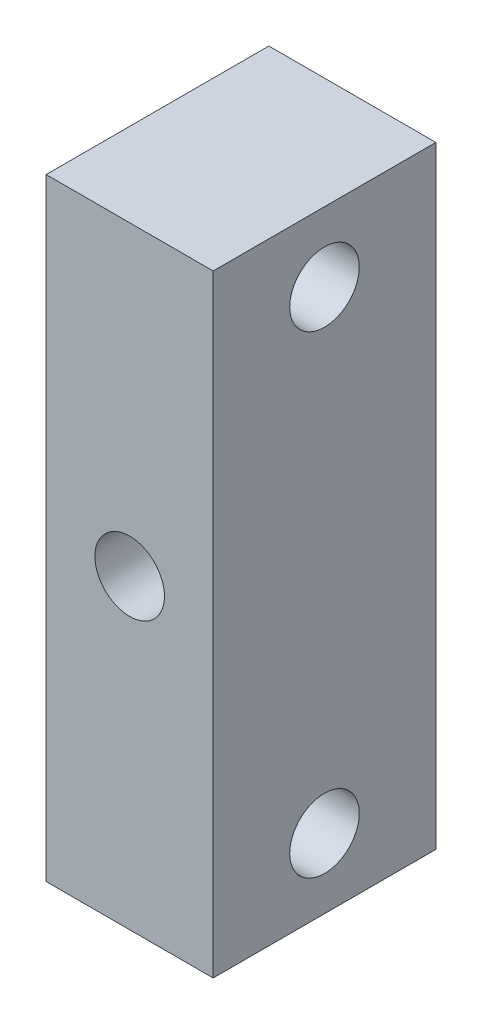
ISO-10303-21;
HEADER;
FILE_DESCRIPTION(('STEP AP214'),'2;1');
FILE_NAME('part.step','',(''),(''),'','','');
FILE_SCHEMA(('AUTOMOTIVE_DESIGN { 1 0 10303 214 1 1 1 1 }'));
ENDSEC;
DATA;
#1=APPLICATION_CONTEXT('core data for automotive mechanical design processes');
#2=APPLICATION_PROTOCOL_DEFINITION('international standard','automotive_design',2000,#1);
#3=PRODUCT_CONTEXT('',#1,'mechanical');
#4=PRODUCT('Part','Part','',(#3));
#5=PRODUCT_RELATED_PRODUCT_CATEGORY('part','',(#4));
#6=PRODUCT_DEFINITION_FORMATION('','',#4);
#7=PRODUCT_DEFINITION_CONTEXT('part definition',#1,'design');
#8=PRODUCT_DEFINITION('design','',#6,#7);
#9=PRODUCT_DEFINITION_SHAPE('','',#8);
#10=(LENGTH_UNIT() NAMED_UNIT(*) SI_UNIT(.MILLI.,.METRE.));
#11=(NAMED_UNIT(*) PLANE_ANGLE_UNIT() SI_UNIT($,.RADIAN.));
#12=(NAMED_UNIT(*) SI_UNIT($,.STERADIAN.) SOLID_ANGLE_UNIT());
#13=UNCERTAINTY_MEASURE_WITH_UNIT(LENGTH_MEASURE(1.E-05),#10,'distance_accuracy_value','');
#14=(GEOMETRIC_REPRESENTATION_CONTEXT(3) GLOBAL_UNCERTAINTY_ASSIGNED_CONTEXT((#13)) GLOBAL_UNIT_ASSIGNED_CONTEXT((#10,
#11,#12)) REPRESENTATION_CONTEXT('',''));
#15=CARTESIAN_POINT('',(0.,0.,0.));
#16=DIRECTION('',(0.,0.,1.));
#17=DIRECTION('',(1.,0.,0.));
#18=AXIS2_PLACEMENT_3D('',#15,#16,#17);
#19=CARTESIAN_POINT('',(3.,11.,-4.));
#20=DIRECTION('',(-1.,0.,0.));
#21=DIRECTION('',(0.,0.,1.));
#22=AXIS2_PLACEMENT_3D('',#19,#20,#21);
#23=PLANE('',#22);
#24=CARTESIAN_POINT('',(3.,8.5,0.));
#25=DIRECTION('',(-1.,0.,0.));
#26=DIRECTION('',(0.,0.,1.));
#27=AXIS2_PLACEMENT_3D('',#24,#25,#26);
#28=CIRCLE('',#27,1.25);
#29=CARTESIAN_POINT('',(3.,8.5,1.25));
#30=VERTEX_POINT('',#29);
#31=EDGE_CURVE('E115',#30,#30,#28,.T.);
#32=ORIENTED_EDGE('',*,*,#31,.T.);
#33=EDGE_LOOP('',(#32));
#34=FACE_BOUND('',#33,.T.);
#35=CARTESIAN_POINT('',(3.,-8.5,0.));
#36=DIRECTION('',(-1.,0.,0.));
#37=DIRECTION('',(0.,0.,1.));
#38=AXIS2_PLACEMENT_3D('',#35,#36,#37);
#39=CIRCLE('',#38,1.25);
#40=CARTESIAN_POINT('',(3.,-8.5,1.25));
#41=VERTEX_POINT('',#40);
#42=EDGE_CURVE('E121',#41,#41,#39,.T.);
#43=ORIENTED_EDGE('',*,*,#42,.T.);
#44=EDGE_LOOP('',(#43));
#45=FACE_BOUND('',#44,.T.);
#46=DIRECTION('',(0.,0.,-1.));
#47=VECTOR('',#46,1.);
#48=CARTESIAN_POINT('',(3.,-11.,-4.));
#49=LINE('',#48,#47);
#50=CARTESIAN_POINT('',(3.,-11.,4.));
#51=VERTEX_POINT('',#50);
#52=CARTESIAN_POINT('',(3.,-11.,-4.));
#53=VERTEX_POINT('',#52);
#54=EDGE_CURVE('E98',#51,#53,#49,.T.);
#55=ORIENTED_EDGE('',*,*,#54,.T.);
#56=DIRECTION('',(0.,-1.,0.));
#57=VECTOR('',#56,1.);
#58=CARTESIAN_POINT('',(3.,11.,-4.));
#59=LINE('',#58,#57);
#60=CARTESIAN_POINT('',(3.,11.,-4.));
#61=VERTEX_POINT('',#60);
#62=EDGE_CURVE('E11',#61,#53,#59,.T.);
#63=ORIENTED_EDGE('',*,*,#62,.F.);
#64=DIRECTION('',(0.,0.,-1.));
#65=VECTOR('',#64,1.);
#66=CARTESIAN_POINT('',(3.,11.,-4.));
#67=LINE('',#66,#65);
#68=CARTESIAN_POINT('',(3.,11.,4.));
#69=VERTEX_POINT('',#68);
#70=EDGE_CURVE('E86',#69,#61,#67,.T.);
#71=ORIENTED_EDGE('',*,*,#70,.F.);
#72=DIRECTION('',(0.,-1.,0.));
#73=VECTOR('',#72,1.);
#74=CARTESIAN_POINT('',(3.,11.,4.));
#75=LINE('',#74,#73);
#76=EDGE_CURVE('E94',#69,#51,#75,.T.);
#77=ORIENTED_EDGE('',*,*,#76,.T.);
#78=EDGE_LOOP('',(#55,#63,#71,#77));
#79=FACE_BOUND('',#78,.T.);
#80=ADVANCED_FACE('F35',(#34,#45,#79),#23,.F.);
#81=CARTESIAN_POINT('',(-3.,11.,-4.));
#82=DIRECTION('',(0.,0.,1.));
#83=DIRECTION('',(1.,0.,0.));
#84=AXIS2_PLACEMENT_3D('',#81,#82,#83);
#85=PLANE('',#84);
#86=CARTESIAN_POINT('',(0.,0.,-4.));
#87=DIRECTION('',(0.,0.,1.));
#88=DIRECTION('',(1.,0.,0.));
#89=AXIS2_PLACEMENT_3D('',#86,#87,#88);
#90=CIRCLE('',#89,1.25);
#91=CARTESIAN_POINT('',(1.25,0.,-4.));
#92=VERTEX_POINT('',#91);
#93=EDGE_CURVE('E101',#92,#92,#90,.T.);
#94=ORIENTED_EDGE('',*,*,#93,.T.);
#95=EDGE_LOOP('',(#94));
#96=FACE_BOUND('',#95,.T.);
#97=DIRECTION('',(-1.,0.,0.));
#98=VECTOR('',#97,1.);
#99=CARTESIAN_POINT('',(-3.,-11.,-4.));
#100=LINE('',#99,#98);
#101=CARTESIAN_POINT('',(-3.,-11.,-4.));
#102=VERTEX_POINT('',#101);
#103=EDGE_CURVE('E90',#53,#102,#100,.T.);
#104=ORIENTED_EDGE('',*,*,#103,.T.);
#105=DIRECTION('',(0.,-1.,0.));
#106=VECTOR('',#105,1.);
#107=CARTESIAN_POINT('',(-3.,11.,-4.));
#108=LINE('',#107,#106);
#109=CARTESIAN_POINT('',(-3.,11.,-4.));
#110=VERTEX_POINT('',#109);
#111=EDGE_CURVE('E43',#110,#102,#108,.T.);
#112=ORIENTED_EDGE('',*,*,#111,.F.);
#113=DIRECTION('',(-1.,0.,0.));
#114=VECTOR('',#113,1.);
#115=CARTESIAN_POINT('',(-3.,11.,-4.));
#116=LINE('',#115,#114);
#117=EDGE_CURVE('E81',#61,#110,#116,.T.);
#118=ORIENTED_EDGE('',*,*,#117,.F.);
#119=ORIENTED_EDGE('',*,*,#62,.T.);
#120=EDGE_LOOP('',(#104,#112,#118,#119));
#121=FACE_BOUND('',#120,.T.);
#122=ADVANCED_FACE('F89',(#96,#121),#85,.F.);
#123=CARTESIAN_POINT('',(-3.,11.,-4.));
#124=DIRECTION('',(1.,0.,0.));
#125=DIRECTION('',(0.,0.,-1.));
#126=AXIS2_PLACEMENT_3D('',#123,#124,#125);
#127=PLANE('',#126);
#128=CARTESIAN_POINT('',(-3.,8.5,0.));
#129=DIRECTION('',(-1.,0.,0.));
#130=DIRECTION('',(0.,0.,1.));
#131=AXIS2_PLACEMENT_3D('',#128,#129,#130);
#132=CIRCLE('',#131,1.25);
#133=CARTESIAN_POINT('',(-3.,8.5,1.25));
#134=VERTEX_POINT('',#133);
#135=EDGE_CURVE('E124',#134,#134,#132,.T.);
#136=ORIENTED_EDGE('',*,*,#135,.F.);
#137=EDGE_LOOP('',(#136));
#138=FACE_BOUND('',#137,.T.);
#139=CARTESIAN_POINT('',(-3.,-8.5,0.));
#140=DIRECTION('',(-1.,0.,0.));
#141=DIRECTION('',(0.,0.,1.));
#142=AXIS2_PLACEMENT_3D('',#139,#140,#141);
#143=CIRCLE('',#142,1.25);
#144=CARTESIAN_POINT('',(-3.,-8.5,1.25));
#145=VERTEX_POINT('',#144);
#146=EDGE_CURVE('E118',#145,#145,#143,.T.);
#147=ORIENTED_EDGE('',*,*,#146,.F.);
#148=EDGE_LOOP('',(#147));
#149=FACE_BOUND('',#148,.T.);
#150=DIRECTION('',(0.,0.,1.));
#151=VECTOR('',#150,1.);
#152=CARTESIAN_POINT('',(-3.,-11.,-4.));
#153=LINE('',#152,#151);
#154=CARTESIAN_POINT('',(-3.,-11.,4.));
#155=VERTEX_POINT('',#154);
#156=EDGE_CURVE('E68',#102,#155,#153,.T.);
#157=ORIENTED_EDGE('',*,*,#156,.T.);
#158=DIRECTION('',(0.,-1.,0.));
#159=VECTOR('',#158,1.);
#160=CARTESIAN_POINT('',(-3.,11.,4.));
#161=LINE('',#160,#159);
#162=CARTESIAN_POINT('',(-3.,11.,4.));
#163=VERTEX_POINT('',#162);
#164=EDGE_CURVE('E91',#163,#155,#161,.T.);
#165=ORIENTED_EDGE('',*,*,#164,.F.);
#166=DIRECTION('',(0.,0.,1.));
#167=VECTOR('',#166,1.);
#168=CARTESIAN_POINT('',(-3.,11.,-4.));
#169=LINE('',#168,#167);
#170=EDGE_CURVE('E84',#110,#163,#169,.T.);
#171=ORIENTED_EDGE('',*,*,#170,.F.);
#172=ORIENTED_EDGE('',*,*,#111,.T.);
#173=EDGE_LOOP('',(#157,#165,#171,#172));
#174=FACE_BOUND('',#173,.T.);
#175=ADVANCED_FACE('F92',(#138,#149,#174),#127,.F.);
#176=CARTESIAN_POINT('',(-3.,11.,4.));
#177=DIRECTION('',(0.,0.,-1.));
#178=DIRECTION('',(-1.,0.,0.));
#179=AXIS2_PLACEMENT_3D('',#176,#177,#178);
#180=PLANE('',#179);
#181=CARTESIAN_POINT('',(0.,0.,4.));
#182=DIRECTION('',(0.,0.,1.));
#183=DIRECTION('',(1.,0.,0.));
#184=AXIS2_PLACEMENT_3D('',#181,#182,#183);
#185=CIRCLE('',#184,1.25);
#186=CARTESIAN_POINT('',(1.25,0.,4.));
#187=VERTEX_POINT('',#186);
#188=EDGE_CURVE('E112',#187,#187,#185,.T.);
#189=ORIENTED_EDGE('',*,*,#188,.F.);
#190=EDGE_LOOP('',(#189));
#191=FACE_BOUND('',#190,.T.);
#192=DIRECTION('',(1.,0.,0.));
#193=VECTOR('',#192,1.);
#194=CARTESIAN_POINT('',(-3.,-11.,4.));
#195=LINE('',#194,#193);
#196=EDGE_CURVE('E74',#155,#51,#195,.T.);
#197=ORIENTED_EDGE('',*,*,#196,.T.);
#198=ORIENTED_EDGE('',*,*,#76,.F.);
#199=DIRECTION('',(1.,0.,0.));
#200=VECTOR('',#199,1.);
#201=CARTESIAN_POINT('',(-3.,11.,4.));
#202=LINE('',#201,#200);
#203=EDGE_CURVE('E51',#163,#69,#202,.T.);
#204=ORIENTED_EDGE('',*,*,#203,.F.);
#205=ORIENTED_EDGE('',*,*,#164,.T.);
#206=EDGE_LOOP('',(#197,#198,#204,#205));
#207=FACE_BOUND('',#206,.T.);
#208=ADVANCED_FACE('F106',(#191,#207),#180,.F.);
#209=CARTESIAN_POINT('',(0.,11.,0.));
#210=DIRECTION('',(0.,1.,0.));
#211=DIRECTION('',(0.,0.,1.));
#212=AXIS2_PLACEMENT_3D('',#209,#210,#211);
#213=PLANE('',#212);
#214=ORIENTED_EDGE('',*,*,#70,.T.);
#215=ORIENTED_EDGE('',*,*,#117,.T.);
#216=ORIENTED_EDGE('',*,*,#170,.T.);
#217=ORIENTED_EDGE('',*,*,#203,.T.);
#218=EDGE_LOOP('',(#214,#215,#216,#217));
#219=FACE_BOUND('',#218,.T.);
#220=ADVANCED_FACE('F82',(#219),#213,.T.);
#221=CARTESIAN_POINT('',(0.,-11.,0.));
#222=DIRECTION('',(0.,1.,0.));
#223=DIRECTION('',(0.,0.,1.));
#224=AXIS2_PLACEMENT_3D('',#221,#222,#223);
#225=PLANE('',#224);
#226=ORIENTED_EDGE('',*,*,#54,.F.);
#227=ORIENTED_EDGE('',*,*,#196,.F.);
#228=ORIENTED_EDGE('',*,*,#156,.F.);
#229=ORIENTED_EDGE('',*,*,#103,.F.);
#230=EDGE_LOOP('',(#226,#227,#228,#229));
#231=FACE_BOUND('',#230,.T.);
#232=ADVANCED_FACE('F109',(#231),#225,.F.);
#233=CARTESIAN_POINT('',(0.,0.,-4.));
#234=DIRECTION('',(0.,0.,1.));
#235=DIRECTION('',(1.,0.,0.));
#236=AXIS2_PLACEMENT_3D('',#233,#234,#235);
#237=CYLINDRICAL_SURFACE('',#236,1.25);
#238=ORIENTED_EDGE('',*,*,#93,.F.);
#239=EDGE_LOOP('',(#238));
#240=FACE_BOUND('',#239,.T.);
#241=ORIENTED_EDGE('',*,*,#188,.T.);
#242=EDGE_LOOP('',(#241));
#243=FACE_BOUND('',#242,.T.);
#244=ADVANCED_FACE('F145',(#240,#243),#237,.F.);
#245=CARTESIAN_POINT('',(3.,-8.5,0.));
#246=DIRECTION('',(-1.,0.,0.));
#247=DIRECTION('',(0.,0.,1.));
#248=AXIS2_PLACEMENT_3D('',#245,#246,#247);
#249=CYLINDRICAL_SURFACE('',#248,1.25);
#250=CARTESIAN_POINT('',(3.,-8.5,1.25));
#251=CARTESIAN_POINT('',(2.9375,-8.5,1.25));
#252=CARTESIAN_POINT('',(2.875,-8.5,1.25));
#253=CARTESIAN_POINT('',(2.75,-8.5,1.25));
#254=CARTESIAN_POINT('',(2.6875,-8.5,1.25));
#255=CARTESIAN_POINT('',(2.5625,-8.5,1.25));
#256=CARTESIAN_POINT('',(2.5,-8.5,1.25));
#257=CARTESIAN_POINT('',(2.375,-8.5,1.25));
#258=CARTESIAN_POINT('',(2.3125,-8.5,1.25));
#259=CARTESIAN_POINT('',(2.1875,-8.5,1.25));
#260=CARTESIAN_POINT('',(2.125,-8.5,1.25));
#261=CARTESIAN_POINT('',(2.,-8.5,1.25));
#262=CARTESIAN_POINT('',(1.9375,-8.5,1.25));
#263=CARTESIAN_POINT('',(1.8125,-8.5,1.25));
#264=CARTESIAN_POINT('',(1.75,-8.5,1.25));
#265=CARTESIAN_POINT('',(1.625,-8.5,1.25));
#266=CARTESIAN_POINT('',(1.5625,-8.5,1.25));
#267=CARTESIAN_POINT('',(1.4375,-8.5,1.25));
#268=CARTESIAN_POINT('',(1.375,-8.5,1.25));
#269=CARTESIAN_POINT('',(1.25,-8.5,1.25));
#270=CARTESIAN_POINT('',(1.1875,-8.5,1.25));
#271=CARTESIAN_POINT('',(1.0625,-8.5,1.25));
#272=CARTESIAN_POINT('',(1.,-8.5,1.25));
#273=CARTESIAN_POINT('',(0.875000000000001,-8.5,1.25));
#274=CARTESIAN_POINT('',(0.812500000000001,-8.5,1.25));
#275=CARTESIAN_POINT('',(0.687500000000001,-8.5,1.25));
#276=CARTESIAN_POINT('',(0.625000000000001,-8.5,1.25));
#277=CARTESIAN_POINT('',(0.500000000000001,-8.5,1.25));
#278=CARTESIAN_POINT('',(0.437500000000001,-8.5,1.25));
#279=CARTESIAN_POINT('',(0.312500000000001,-8.5,1.25));
#280=CARTESIAN_POINT('',(0.250000000000001,-8.5,1.25));
#281=CARTESIAN_POINT('',(0.125000000000001,-8.5,1.25));
#282=CARTESIAN_POINT('',(0.0625000000000005,-8.5,1.25));
#283=CARTESIAN_POINT('',(-0.0624999999999996,-8.5,1.25));
#284=CARTESIAN_POINT('',(-0.125,-8.5,1.25));
#285=CARTESIAN_POINT('',(-0.25,-8.5,1.25));
#286=CARTESIAN_POINT('',(-0.3125,-8.5,1.25));
#287=CARTESIAN_POINT('',(-0.4375,-8.5,1.25));
#288=CARTESIAN_POINT('',(-0.5,-8.5,1.25));
#289=CARTESIAN_POINT('',(-0.625,-8.5,1.25));
#290=CARTESIAN_POINT('',(-0.6875,-8.5,1.25));
#291=CARTESIAN_POINT('',(-0.8125,-8.5,1.25));
#292=CARTESIAN_POINT('',(-0.874999999999999,-8.5,1.25));
#293=CARTESIAN_POINT('',(-0.999999999999999,-8.5,1.25));
#294=CARTESIAN_POINT('',(-1.0625,-8.5,1.25));
#295=CARTESIAN_POINT('',(-1.1875,-8.5,1.25));
#296=CARTESIAN_POINT('',(-1.25,-8.5,1.25));
#297=CARTESIAN_POINT('',(-1.375,-8.5,1.25));
#298=CARTESIAN_POINT('',(-1.4375,-8.5,1.25));
#299=CARTESIAN_POINT('',(-1.5625,-8.5,1.25));
#300=CARTESIAN_POINT('',(-1.625,-8.5,1.25));
#301=CARTESIAN_POINT('',(-1.75,-8.5,1.25));
#302=CARTESIAN_POINT('',(-1.8125,-8.5,1.25));
#303=CARTESIAN_POINT('',(-1.9375,-8.5,1.25));
#304=CARTESIAN_POINT('',(-2.,-8.5,1.25));
#305=CARTESIAN_POINT('',(-2.125,-8.5,1.25));
#306=CARTESIAN_POINT('',(-2.1875,-8.5,1.25));
#307=CARTESIAN_POINT('',(-2.3125,-8.5,1.25));
#308=CARTESIAN_POINT('',(-2.375,-8.5,1.25));
#309=CARTESIAN_POINT('',(-2.5,-8.5,1.25));
#310=CARTESIAN_POINT('',(-2.5625,-8.5,1.25));
#311=CARTESIAN_POINT('',(-2.6875,-8.5,1.25));
#312=CARTESIAN_POINT('',(-2.75,-8.5,1.25));
#313=CARTESIAN_POINT('',(-2.875,-8.5,1.25));
#314=CARTESIAN_POINT('',(-2.9375,-8.5,1.25));
#315=CARTESIAN_POINT('',(-3.,-8.5,1.25));
#316=B_SPLINE_CURVE_WITH_KNOTS('',3,(#250,#251,#252,#253,#254,#255,#256,#257,#258,#259,#260,
#261,#262,#263,#264,#265,#266,#267,#268,#269,#270,#271,#272,#273,#274,#275,#276,#277,#278,#279,
#280,#281,#282,#283,#284,#285,#286,#287,#288,#289,#290,#291,#292,#293,#294,#295,#296,#297,#298,
#299,#300,#301,#302,#303,#304,#305,#306,#307,#308,#309,#310,#311,#312,#313,#314,#315),
.UNSPECIFIED.,.F.,.F.,(4,2,2,2,2,2,2,2,2,2,2,2,2,2,2,2,2,2,2,2,2,2,2,2,2,2,2,2,2,2,2,2,4),(0.,
0.1875,0.375,0.5625,0.75,0.9375,1.125,1.3125,1.5,1.6875,1.875,2.0625,2.25,2.4375,2.625,2.8125,
3.,3.1875,3.375,3.5625,3.75,3.9375,4.125,4.3125,4.5,4.6875,4.875,5.0625,5.25,5.4375,5.625,
5.8125,6.),.UNSPECIFIED.);
#317=EDGE_CURVE('BSEAM135',#41,#145,#316,.T.);
#318=ORIENTED_EDGE('',*,*,#42,.F.);
#319=ORIENTED_EDGE('',*,*,#146,.T.);
#320=ORIENTED_EDGE('',*,*,#317,.T.);
#321=ORIENTED_EDGE('',*,*,#317,.F.);
#322=EDGE_LOOP('',(#318,#320,#319,#321));
#323=FACE_BOUND('',#322,.T.);
#324=ADVANCED_FACE('F135',(#323),#249,.F.);
#325=CARTESIAN_POINT('',(3.,8.5,0.));
#326=DIRECTION('',(-1.,0.,0.));
#327=DIRECTION('',(0.,0.,1.));
#328=AXIS2_PLACEMENT_3D('',#325,#326,#327);
#329=CYLINDRICAL_SURFACE('',#328,1.25);
#330=CARTESIAN_POINT('',(3.,8.5,1.25));
#331=CARTESIAN_POINT('',(2.9375,8.5,1.25));
#332=CARTESIAN_POINT('',(2.875,8.5,1.25));
#333=CARTESIAN_POINT('',(2.75,8.5,1.25));
#334=CARTESIAN_POINT('',(2.6875,8.5,1.25));
#335=CARTESIAN_POINT('',(2.5625,8.5,1.25));
#336=CARTESIAN_POINT('',(2.5,8.5,1.25));
#337=CARTESIAN_POINT('',(2.375,8.5,1.25));
#338=CARTESIAN_POINT('',(2.3125,8.5,1.25));
#339=CARTESIAN_POINT('',(2.1875,8.5,1.25));
#340=CARTESIAN_POINT('',(2.125,8.5,1.25));
#341=CARTESIAN_POINT('',(2.,8.5,1.25));
#342=CARTESIAN_POINT('',(1.9375,8.5,1.25));
#343=CARTESIAN_POINT('',(1.8125,8.5,1.25));
#344=CARTESIAN_POINT('',(1.75,8.5,1.25));
#345=CARTESIAN_POINT('',(1.625,8.5,1.25));
#346=CARTESIAN_POINT('',(1.5625,8.5,1.25));
#347=CARTESIAN_POINT('',(1.4375,8.5,1.25));
#348=CARTESIAN_POINT('',(1.375,8.5,1.25));
#349=CARTESIAN_POINT('',(1.25,8.5,1.25));
#350=CARTESIAN_POINT('',(1.1875,8.5,1.25));
#351=CARTESIAN_POINT('',(1.0625,8.5,1.25));
#352=CARTESIAN_POINT('',(1.,8.5,1.25));
#353=CARTESIAN_POINT('',(0.875000000000001,8.5,1.25));
#354=CARTESIAN_POINT('',(0.812500000000001,8.5,1.25));
#355=CARTESIAN_POINT('',(0.687500000000001,8.5,1.25));
#356=CARTESIAN_POINT('',(0.625000000000001,8.5,1.25));
#357=CARTESIAN_POINT('',(0.500000000000001,8.5,1.25));
#358=CARTESIAN_POINT('',(0.437500000000001,8.5,1.25));
#359=CARTESIAN_POINT('',(0.312500000000001,8.5,1.25));
#360=CARTESIAN_POINT('',(0.250000000000001,8.5,1.25));
#361=CARTESIAN_POINT('',(0.125000000000001,8.5,1.25));
#362=CARTESIAN_POINT('',(0.0625000000000005,8.5,1.25));
#363=CARTESIAN_POINT('',(-0.0624999999999996,8.5,1.25));
#364=CARTESIAN_POINT('',(-0.125,8.5,1.25));
#365=CARTESIAN_POINT('',(-0.25,8.5,1.25));
#366=CARTESIAN_POINT('',(-0.3125,8.5,1.25));
#367=CARTESIAN_POINT('',(-0.4375,8.5,1.25));
#368=CARTESIAN_POINT('',(-0.5,8.5,1.25));
#369=CARTESIAN_POINT('',(-0.625,8.5,1.25));
#370=CARTESIAN_POINT('',(-0.6875,8.5,1.25));
#371=CARTESIAN_POINT('',(-0.8125,8.5,1.25));
#372=CARTESIAN_POINT('',(-0.874999999999999,8.5,1.25));
#373=CARTESIAN_POINT('',(-0.999999999999999,8.5,1.25));
#374=CARTESIAN_POINT('',(-1.0625,8.5,1.25));
#375=CARTESIAN_POINT('',(-1.1875,8.5,1.25));
#376=CARTESIAN_POINT('',(-1.25,8.5,1.25));
#377=CARTESIAN_POINT('',(-1.375,8.5,1.25));
#378=CARTESIAN_POINT('',(-1.4375,8.5,1.25));
#379=CARTESIAN_POINT('',(-1.5625,8.5,1.25));
#380=CARTESIAN_POINT('',(-1.625,8.5,1.25));
#381=CARTESIAN_POINT('',(-1.75,8.5,1.25));
#382=CARTESIAN_POINT('',(-1.8125,8.5,1.25));
#383=CARTESIAN_POINT('',(-1.9375,8.5,1.25));
#384=CARTESIAN_POINT('',(-2.,8.5,1.25));
#385=CARTESIAN_POINT('',(-2.125,8.5,1.25));
#386=CARTESIAN_POINT('',(-2.1875,8.5,1.25));
#387=CARTESIAN_POINT('',(-2.3125,8.5,1.25));
#388=CARTESIAN_POINT('',(-2.375,8.5,1.25));
#389=CARTESIAN_POINT('',(-2.5,8.5,1.25));
#390=CARTESIAN_POINT('',(-2.5625,8.5,1.25));
#391=CARTESIAN_POINT('',(-2.6875,8.5,1.25));
#392=CARTESIAN_POINT('',(-2.75,8.5,1.25));
#393=CARTESIAN_POINT('',(-2.875,8.5,1.25));
#394=CARTESIAN_POINT('',(-2.9375,8.5,1.25));
#395=CARTESIAN_POINT('',(-3.,8.5,1.25));
#396=B_SPLINE_CURVE_WITH_KNOTS('',3,(#330,#331,#332,#333,#334,#335,#336,#337,#338,#339,#340,
#341,#342,#343,#344,#345,#346,#347,#348,#349,#350,#351,#352,#353,#354,#355,#356,#357,#358,#359,
#360,#361,#362,#363,#364,#365,#366,#367,#368,#369,#370,#371,#372,#373,#374,#375,#376,#377,#378,
#379,#380,#381,#382,#383,#384,#385,#386,#387,#388,#389,#390,#391,#392,#393,#394,#395),
.UNSPECIFIED.,.F.,.F.,(4,2,2,2,2,2,2,2,2,2,2,2,2,2,2,2,2,2,2,2,2,2,2,2,2,2,2,2,2,2,2,2,4),(0.,
0.1875,0.375,0.5625,0.75,0.9375,1.125,1.3125,1.5,1.6875,1.875,2.0625,2.25,2.4375,2.625,2.8125,
3.,3.1875,3.375,3.5625,3.75,3.9375,4.125,4.3125,4.5,4.6875,4.875,5.0625,5.25,5.4375,5.625,
5.8125,6.),.UNSPECIFIED.);
#397=EDGE_CURVE('BSEAM132',#30,#134,#396,.T.);
#398=ORIENTED_EDGE('',*,*,#31,.F.);
#399=ORIENTED_EDGE('',*,*,#135,.T.);
#400=ORIENTED_EDGE('',*,*,#397,.T.);
#401=ORIENTED_EDGE('',*,*,#397,.F.);
#402=EDGE_LOOP('',(#398,#400,#399,#401));
#403=FACE_BOUND('',#402,.T.);
#404=ADVANCED_FACE('F132',(#403),#329,.F.);
#405=CLOSED_SHELL('',(#80,#122,#175,#208,#220,#232,#244,#324,#404));
#406=MANIFOLD_SOLID_BREP('B2',#405);
#407=ADVANCED_BREP_SHAPE_REPRESENTATION('',(#18,#406),#14);
#408=SHAPE_DEFINITION_REPRESENTATION(#9,#407);
ENDSEC;
END-ISO-10303-21;
